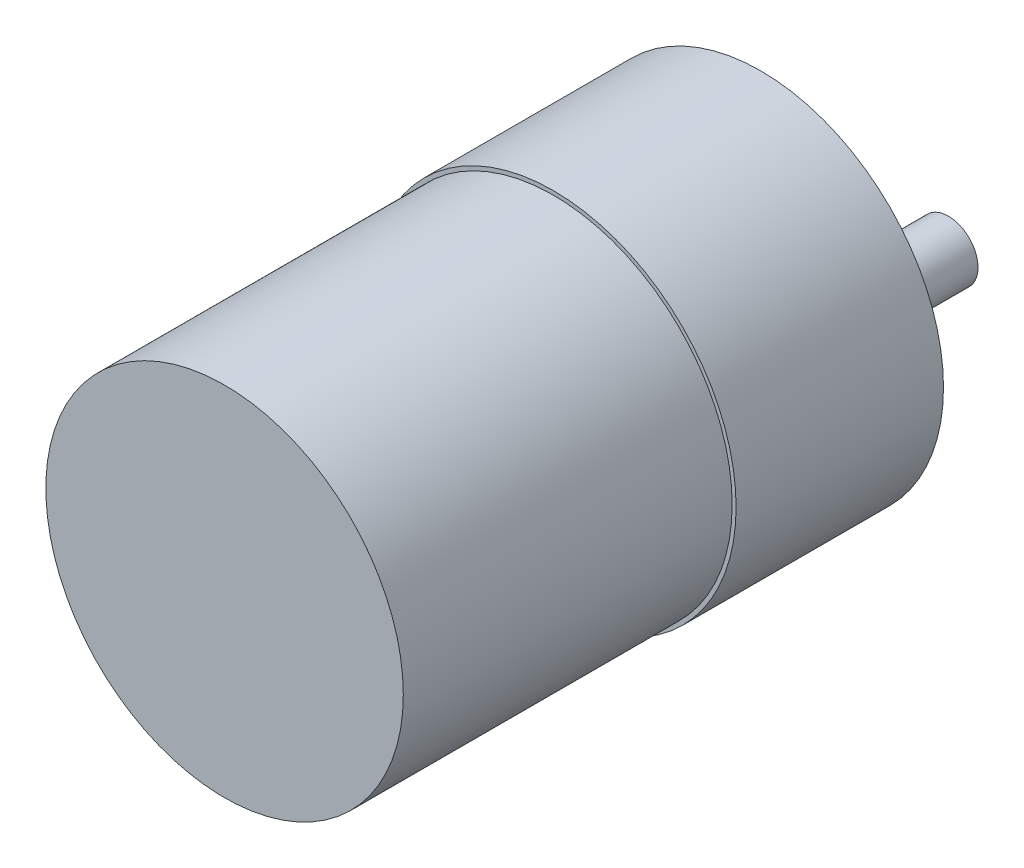
ISO-10303-21;
HEADER;
FILE_DESCRIPTION(('STEP AP214'),'2;1');
FILE_NAME('part.step','',(''),(''),'','','');
FILE_SCHEMA(('AUTOMOTIVE_DESIGN { 1 0 10303 214 1 1 1 1 }'));
ENDSEC;
DATA;
#1=APPLICATION_CONTEXT('core data for automotive mechanical design processes');
#2=APPLICATION_PROTOCOL_DEFINITION('international standard','automotive_design',2000,#1);
#3=PRODUCT_CONTEXT('',#1,'mechanical');
#4=PRODUCT('Part','Part','',(#3));
#5=PRODUCT_RELATED_PRODUCT_CATEGORY('part','',(#4));
#6=PRODUCT_DEFINITION_FORMATION('','',#4);
#7=PRODUCT_DEFINITION_CONTEXT('part definition',#1,'design');
#8=PRODUCT_DEFINITION('design','',#6,#7);
#9=PRODUCT_DEFINITION_SHAPE('','',#8);
#10=(LENGTH_UNIT() NAMED_UNIT(*) SI_UNIT(.MILLI.,.METRE.));
#11=(NAMED_UNIT(*) PLANE_ANGLE_UNIT() SI_UNIT($,.RADIAN.));
#12=(NAMED_UNIT(*) SI_UNIT($,.STERADIAN.) SOLID_ANGLE_UNIT());
#13=UNCERTAINTY_MEASURE_WITH_UNIT(LENGTH_MEASURE(1.E-05),#10,'distance_accuracy_value','');
#14=(GEOMETRIC_REPRESENTATION_CONTEXT(3) GLOBAL_UNCERTAINTY_ASSIGNED_CONTEXT((#13)) GLOBAL_UNIT_ASSIGNED_CONTEXT((#10,
#11,#12)) REPRESENTATION_CONTEXT('',''));
#15=CARTESIAN_POINT('',(0.,0.,0.));
#16=DIRECTION('',(0.,0.,1.));
#17=DIRECTION('',(1.,0.,0.));
#18=AXIS2_PLACEMENT_3D('',#15,#16,#17);
#19=CARTESIAN_POINT('',(0.,0.,21.));
#20=DIRECTION('',(0.,0.,-1.));
#21=DIRECTION('',(-1.,0.,0.));
#22=AXIS2_PLACEMENT_3D('',#19,#20,#21);
#23=CYLINDRICAL_SURFACE('',#22,18.5);
#24=CARTESIAN_POINT('',(0.,0.,21.));
#25=DIRECTION('',(0.,0.,1.));
#26=DIRECTION('',(1.,0.,0.));
#27=AXIS2_PLACEMENT_3D('',#24,#25,#26);
#28=CIRCLE('',#27,18.5);
#29=CARTESIAN_POINT('',(-18.5,0.,21.));
#30=VERTEX_POINT('',#29);
#31=EDGE_CURVE('E39',#30,#30,#28,.T.);
#32=CARTESIAN_POINT('',(0.,0.,0.));
#33=DIRECTION('',(0.,0.,1.));
#34=DIRECTION('',(1.,0.,0.));
#35=AXIS2_PLACEMENT_3D('',#32,#33,#34);
#36=CIRCLE('',#35,18.5);
#37=CARTESIAN_POINT('',(-18.5,0.,0.));
#38=VERTEX_POINT('',#37);
#39=EDGE_CURVE('E43',#38,#38,#36,.T.);
#40=CARTESIAN_POINT('',(-18.5,0.,21.));
#41=CARTESIAN_POINT('',(-18.5,0.,20.78125));
#42=CARTESIAN_POINT('',(-18.5,0.,20.5625));
#43=CARTESIAN_POINT('',(-18.5,0.,20.125));
#44=CARTESIAN_POINT('',(-18.5,0.,19.90625));
#45=CARTESIAN_POINT('',(-18.5,0.,19.46875));
#46=CARTESIAN_POINT('',(-18.5,0.,19.25));
#47=CARTESIAN_POINT('',(-18.5,0.,18.8125));
#48=CARTESIAN_POINT('',(-18.5,0.,18.59375));
#49=CARTESIAN_POINT('',(-18.5,0.,18.15625));
#50=CARTESIAN_POINT('',(-18.5,0.,17.9375));
#51=CARTESIAN_POINT('',(-18.5,0.,17.5));
#52=CARTESIAN_POINT('',(-18.5,0.,17.28125));
#53=CARTESIAN_POINT('',(-18.5,0.,16.84375));
#54=CARTESIAN_POINT('',(-18.5,0.,16.625));
#55=CARTESIAN_POINT('',(-18.5,0.,16.1875));
#56=CARTESIAN_POINT('',(-18.5,0.,15.96875));
#57=CARTESIAN_POINT('',(-18.5,0.,15.53125));
#58=CARTESIAN_POINT('',(-18.5,0.,15.3125));
#59=CARTESIAN_POINT('',(-18.5,0.,14.875));
#60=CARTESIAN_POINT('',(-18.5,0.,14.65625));
#61=CARTESIAN_POINT('',(-18.5,0.,14.21875));
#62=CARTESIAN_POINT('',(-18.5,0.,14.));
#63=CARTESIAN_POINT('',(-18.5,0.,13.5625));
#64=CARTESIAN_POINT('',(-18.5,0.,13.34375));
#65=CARTESIAN_POINT('',(-18.5,0.,12.90625));
#66=CARTESIAN_POINT('',(-18.5,0.,12.6875));
#67=CARTESIAN_POINT('',(-18.5,0.,12.25));
#68=CARTESIAN_POINT('',(-18.5,0.,12.03125));
#69=CARTESIAN_POINT('',(-18.5,0.,11.59375));
#70=CARTESIAN_POINT('',(-18.5,0.,11.375));
#71=CARTESIAN_POINT('',(-18.5,0.,10.9375));
#72=CARTESIAN_POINT('',(-18.5,0.,10.71875));
#73=CARTESIAN_POINT('',(-18.5,0.,10.28125));
#74=CARTESIAN_POINT('',(-18.5,0.,10.0625));
#75=CARTESIAN_POINT('',(-18.5,0.,9.625));
#76=CARTESIAN_POINT('',(-18.5,0.,9.40625));
#77=CARTESIAN_POINT('',(-18.5,0.,8.96875));
#78=CARTESIAN_POINT('',(-18.5,0.,8.75));
#79=CARTESIAN_POINT('',(-18.5,0.,8.3125));
#80=CARTESIAN_POINT('',(-18.5,0.,8.09375));
#81=CARTESIAN_POINT('',(-18.5,0.,7.65625));
#82=CARTESIAN_POINT('',(-18.5,0.,7.4375));
#83=CARTESIAN_POINT('',(-18.5,0.,7.));
#84=CARTESIAN_POINT('',(-18.5,0.,6.78125));
#85=CARTESIAN_POINT('',(-18.5,0.,6.34375));
#86=CARTESIAN_POINT('',(-18.5,0.,6.125));
#87=CARTESIAN_POINT('',(-18.5,0.,5.6875));
#88=CARTESIAN_POINT('',(-18.5,0.,5.46875));
#89=CARTESIAN_POINT('',(-18.5,0.,5.03125));
#90=CARTESIAN_POINT('',(-18.5,0.,4.8125));
#91=CARTESIAN_POINT('',(-18.5,0.,4.375));
#92=CARTESIAN_POINT('',(-18.5,0.,4.15625));
#93=CARTESIAN_POINT('',(-18.5,0.,3.71875));
#94=CARTESIAN_POINT('',(-18.5,0.,3.5));
#95=CARTESIAN_POINT('',(-18.5,0.,3.0625));
#96=CARTESIAN_POINT('',(-18.5,0.,2.84375));
#97=CARTESIAN_POINT('',(-18.5,0.,2.40625));
#98=CARTESIAN_POINT('',(-18.5,0.,2.1875));
#99=CARTESIAN_POINT('',(-18.5,0.,1.75));
#100=CARTESIAN_POINT('',(-18.5,0.,1.53125));
#101=CARTESIAN_POINT('',(-18.5,0.,1.09375));
#102=CARTESIAN_POINT('',(-18.5,0.,0.875000000000001));
#103=CARTESIAN_POINT('',(-18.5,0.,0.4375));
#104=CARTESIAN_POINT('',(-18.5,0.,0.21875));
#105=CARTESIAN_POINT('',(-18.5,0.,0.));
#106=B_SPLINE_CURVE_WITH_KNOTS('',3,(#40,#41,#42,#43,#44,#45,#46,#47,#48,#49,#50,#51,#52,#53,
#54,#55,#56,#57,#58,#59,#60,#61,#62,#63,#64,#65,#66,#67,#68,#69,#70,#71,#72,#73,#74,#75,#76,#77,
#78,#79,#80,#81,#82,#83,#84,#85,#86,#87,#88,#89,#90,#91,#92,#93,#94,#95,#96,#97,#98,#99,#100,
#101,#102,#103,#104,#105),.UNSPECIFIED.,.F.,.F.,(4,2,2,2,2,2,2,2,2,2,2,2,2,2,2,2,2,2,2,2,2,2,2,
2,2,2,2,2,2,2,2,2,4),(0.,0.656250000000001,1.3125,1.96875,2.625,3.28125,3.9375,4.59375,5.25,
5.90625,6.5625,7.21875,7.875,8.53125,9.1875,9.84375,10.5,11.15625,11.8125,12.46875,13.125,
13.78125,14.4375,15.09375,15.75,16.40625,17.0625,17.71875,18.375,19.03125,19.6875,20.34375,21.),.UNSPECIFIED.);
#107=EDGE_CURVE('BSEAM33',#30,#38,#106,.T.);
#108=ORIENTED_EDGE('',*,*,#31,.F.);
#109=ORIENTED_EDGE('',*,*,#39,.T.);
#110=ORIENTED_EDGE('',*,*,#107,.T.);
#111=ORIENTED_EDGE('',*,*,#107,.F.);
#112=EDGE_LOOP('',(#108,#110,#109,#111));
#113=FACE_BOUND('',#112,.T.);
#114=ADVANCED_FACE('F33',(#113),#23,.T.);
#115=CARTESIAN_POINT('',(0.,0.,21.));
#116=DIRECTION('',(0.,0.,1.));
#117=DIRECTION('',(1.,0.,0.));
#118=AXIS2_PLACEMENT_3D('',#115,#116,#117);
#119=PLANE('',#118);
#120=CARTESIAN_POINT('',(0.,0.,21.));
#121=DIRECTION('',(0.,0.,1.));
#122=DIRECTION('',(1.,0.,0.));
#123=AXIS2_PLACEMENT_3D('',#120,#121,#122);
#124=CIRCLE('',#123,18.1);
#125=CARTESIAN_POINT('',(18.1,0.,21.));
#126=VERTEX_POINT('',#125);
#127=EDGE_CURVE('E50',#126,#126,#124,.T.);
#128=ORIENTED_EDGE('',*,*,#127,.F.);
#129=EDGE_LOOP('',(#128));
#130=FACE_BOUND('',#129,.T.);
#131=ORIENTED_EDGE('',*,*,#31,.T.);
#132=EDGE_LOOP('',(#131));
#133=FACE_BOUND('',#132,.T.);
#134=ADVANCED_FACE('F90',(#130,#133),#119,.T.);
#135=CARTESIAN_POINT('',(0.,0.,0.));
#136=DIRECTION('',(0.,0.,1.));
#137=DIRECTION('',(1.,0.,0.));
#138=AXIS2_PLACEMENT_3D('',#135,#136,#137);
#139=PLANE('',#138);
#140=CARTESIAN_POINT('',(0.,-6.742,0.));
#141=DIRECTION('',(0.,0.,1.));
#142=DIRECTION('',(1.,0.,0.));
#143=AXIS2_PLACEMENT_3D('',#140,#141,#142);
#144=CIRCLE('',#143,6.);
#145=CARTESIAN_POINT('',(6.,-6.742,0.));
#146=VERTEX_POINT('',#145);
#147=EDGE_CURVE('E10',#146,#146,#144,.F.);
#148=ORIENTED_EDGE('',*,*,#147,.F.);
#149=EDGE_LOOP('',(#148));
#150=FACE_BOUND('',#149,.T.);
#151=ORIENTED_EDGE('',*,*,#39,.F.);
#152=EDGE_LOOP('',(#151));
#153=FACE_BOUND('',#152,.T.);
#154=ADVANCED_FACE('F95',(#150,#153),#139,.F.);
#155=CARTESIAN_POINT('',(0.,0.,54.3));
#156=DIRECTION('',(0.,0.,-1.));
#157=DIRECTION('',(-1.,0.,0.));
#158=AXIS2_PLACEMENT_3D('',#155,#156,#157);
#159=CYLINDRICAL_SURFACE('',#158,18.1);
#160=CARTESIAN_POINT('',(0.,0.,54.3));
#161=DIRECTION('',(0.,0.,1.));
#162=DIRECTION('',(1.,0.,0.));
#163=AXIS2_PLACEMENT_3D('',#160,#161,#162);
#164=CIRCLE('',#163,18.1);
#165=CARTESIAN_POINT('',(18.1,0.,54.3));
#166=VERTEX_POINT('',#165);
#167=EDGE_CURVE('E48',#166,#166,#164,.T.);
#168=ORIENTED_EDGE('',*,*,#167,.F.);
#169=EDGE_LOOP('',(#168));
#170=FACE_BOUND('',#169,.T.);
#171=ORIENTED_EDGE('',*,*,#127,.T.);
#172=EDGE_LOOP('',(#171));
#173=FACE_BOUND('',#172,.T.);
#174=ADVANCED_FACE('F86',(#170,#173),#159,.T.);
#175=CARTESIAN_POINT('',(0.,0.,54.3));
#176=DIRECTION('',(0.,0.,1.));
#177=DIRECTION('',(1.,0.,0.));
#178=AXIS2_PLACEMENT_3D('',#175,#176,#177);
#179=PLANE('',#178);
#180=ORIENTED_EDGE('',*,*,#167,.T.);
#181=EDGE_LOOP('',(#180));
#182=FACE_BOUND('',#181,.T.);
#183=ADVANCED_FACE('F81',(#182),#179,.T.);
#184=CARTESIAN_POINT('',(0.,-6.742,-5.));
#185=DIRECTION('',(0.,0.,1.));
#186=DIRECTION('',(1.,0.,0.));
#187=AXIS2_PLACEMENT_3D('',#184,#185,#186);
#188=CYLINDRICAL_SURFACE('',#187,6.);
#189=CARTESIAN_POINT('',(0.,-6.742,-5.));
#190=DIRECTION('',(0.,0.,-1.));
#191=DIRECTION('',(-1.,0.,0.));
#192=AXIS2_PLACEMENT_3D('',#189,#190,#191);
#193=CIRCLE('',#192,6.);
#194=CARTESIAN_POINT('',(-6.,-6.742,-5.));
#195=VERTEX_POINT('',#194);
#196=EDGE_CURVE('E53',#195,#195,#193,.T.);
#197=ORIENTED_EDGE('',*,*,#196,.F.);
#198=EDGE_LOOP('',(#197));
#199=FACE_BOUND('',#198,.T.);
#200=ORIENTED_EDGE('',*,*,#147,.T.);
#201=EDGE_LOOP('',(#200));
#202=FACE_BOUND('',#201,.T.);
#203=ADVANCED_FACE('F76',(#199,#202),#188,.T.);
#204=CARTESIAN_POINT('',(0.,-6.742,-5.));
#205=DIRECTION('',(0.,0.,-1.));
#206=DIRECTION('',(-1.,0.,0.));
#207=AXIS2_PLACEMENT_3D('',#204,#205,#206);
#208=PLANE('',#207);
#209=CARTESIAN_POINT('',(0.,-6.742,-5.));
#210=DIRECTION('',(0.,0.,-1.));
#211=DIRECTION('',(-1.,0.,0.));
#212=AXIS2_PLACEMENT_3D('',#209,#210,#211);
#213=CIRCLE('',#212,3.);
#214=CARTESIAN_POINT('',(-3.,-6.742,-5.));
#215=VERTEX_POINT('',#214);
#216=EDGE_CURVE('E59',#215,#215,#213,.T.);
#217=ORIENTED_EDGE('',*,*,#216,.F.);
#218=EDGE_LOOP('',(#217));
#219=FACE_BOUND('',#218,.T.);
#220=ORIENTED_EDGE('',*,*,#196,.T.);
#221=EDGE_LOOP('',(#220));
#222=FACE_BOUND('',#221,.T.);
#223=ADVANCED_FACE('F70',(#219,#222),#208,.T.);
#224=CARTESIAN_POINT('',(0.,-6.742,-19.));
#225=DIRECTION('',(0.,0.,1.));
#226=DIRECTION('',(1.,0.,0.));
#227=AXIS2_PLACEMENT_3D('',#224,#225,#226);
#228=CYLINDRICAL_SURFACE('',#227,3.);
#229=CARTESIAN_POINT('',(0.,-6.742,-19.));
#230=DIRECTION('',(0.,0.,-1.));
#231=DIRECTION('',(-1.,0.,0.));
#232=AXIS2_PLACEMENT_3D('',#229,#230,#231);
#233=CIRCLE('',#232,3.);
#234=CARTESIAN_POINT('',(-3.,-6.742,-19.));
#235=VERTEX_POINT('',#234);
#236=EDGE_CURVE('E58',#235,#235,#233,.T.);
#237=ORIENTED_EDGE('',*,*,#236,.F.);
#238=EDGE_LOOP('',(#237));
#239=FACE_BOUND('',#238,.T.);
#240=ORIENTED_EDGE('',*,*,#216,.T.);
#241=EDGE_LOOP('',(#240));
#242=FACE_BOUND('',#241,.T.);
#243=ADVANCED_FACE('F67',(#239,#242),#228,.T.);
#244=CARTESIAN_POINT('',(0.,-6.742,-19.));
#245=DIRECTION('',(0.,0.,-1.));
#246=DIRECTION('',(-1.,0.,0.));
#247=AXIS2_PLACEMENT_3D('',#244,#245,#246);
#248=PLANE('',#247);
#249=ORIENTED_EDGE('',*,*,#236,.T.);
#250=EDGE_LOOP('',(#249));
#251=FACE_BOUND('',#250,.T.);
#252=ADVANCED_FACE('F65',(#251),#248,.T.);
#253=CLOSED_SHELL('',(#114,#134,#154,#174,#183,#203,#223,#243,#252));
#254=MANIFOLD_SOLID_BREP('B2',#253);
#255=ADVANCED_BREP_SHAPE_REPRESENTATION('',(#18,#254),#14);
#256=SHAPE_DEFINITION_REPRESENTATION(#9,#255);
ENDSEC;
END-ISO-10303-21;
